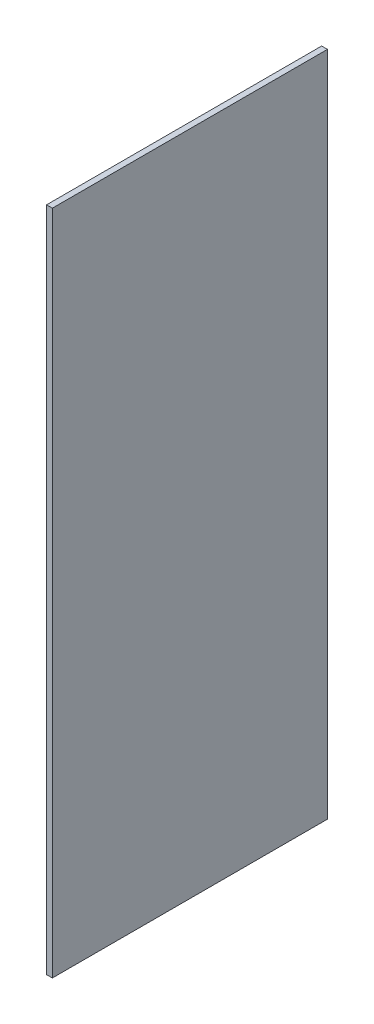
ISO-10303-21;
HEADER;
FILE_DESCRIPTION(('STEP AP214'),'2;1');
FILE_NAME('part.step','',(''),(''),'','','');
FILE_SCHEMA(('AUTOMOTIVE_DESIGN { 1 0 10303 214 1 1 1 1 }'));
ENDSEC;
DATA;
#1=APPLICATION_CONTEXT('core data for automotive mechanical design processes');
#2=APPLICATION_PROTOCOL_DEFINITION('international standard','automotive_design',2000,#1);
#3=PRODUCT_CONTEXT('',#1,'mechanical');
#4=PRODUCT('Part','Part','',(#3));
#5=PRODUCT_RELATED_PRODUCT_CATEGORY('part','',(#4));
#6=PRODUCT_DEFINITION_FORMATION('','',#4);
#7=PRODUCT_DEFINITION_CONTEXT('part definition',#1,'design');
#8=PRODUCT_DEFINITION('design','',#6,#7);
#9=PRODUCT_DEFINITION_SHAPE('','',#8);
#10=(LENGTH_UNIT() NAMED_UNIT(*) SI_UNIT(.MILLI.,.METRE.));
#11=(NAMED_UNIT(*) PLANE_ANGLE_UNIT() SI_UNIT($,.RADIAN.));
#12=(NAMED_UNIT(*) SI_UNIT($,.STERADIAN.) SOLID_ANGLE_UNIT());
#13=UNCERTAINTY_MEASURE_WITH_UNIT(LENGTH_MEASURE(1.E-05),#10,'distance_accuracy_value','');
#14=(GEOMETRIC_REPRESENTATION_CONTEXT(3) GLOBAL_UNCERTAINTY_ASSIGNED_CONTEXT((#13)) GLOBAL_UNIT_ASSIGNED_CONTEXT((#10,
#11,#12)) REPRESENTATION_CONTEXT('',''));
#15=CARTESIAN_POINT('',(0.,0.,0.));
#16=DIRECTION('',(0.,0.,1.));
#17=DIRECTION('',(1.,0.,0.));
#18=AXIS2_PLACEMENT_3D('',#15,#16,#17);
#19=CARTESIAN_POINT('',(281.,-45.,128.442125645559));
#20=DIRECTION('',(0.,0.,-1.));
#21=DIRECTION('',(-1.,0.,0.));
#22=AXIS2_PLACEMENT_3D('',#19,#20,#21);
#23=PLANE('',#22);
#24=DIRECTION('',(0.,-1.,0.));
#25=VECTOR('',#24,1.);
#26=CARTESIAN_POINT('',(280.,-45.,128.442125645559));
#27=LINE('',#26,#25);
#28=CARTESIAN_POINT('',(280.,69.8959813156576,128.442125645559));
#29=VERTEX_POINT('',#28);
#30=CARTESIAN_POINT('',(280.,-45.,128.442125645559));
#31=VERTEX_POINT('',#30);
#32=EDGE_CURVE('E101',#29,#31,#27,.T.);
#33=ORIENTED_EDGE('',*,*,#32,.T.);
#34=DIRECTION('',(-1.,0.,0.));
#35=VECTOR('',#34,1.);
#36=CARTESIAN_POINT('',(281.,-45.,128.442125645559));
#37=LINE('',#36,#35);
#38=CARTESIAN_POINT('',(281.,-45.,128.442125645559));
#39=VERTEX_POINT('',#38);
#40=EDGE_CURVE('E11',#39,#31,#37,.T.);
#41=ORIENTED_EDGE('',*,*,#40,.F.);
#42=DIRECTION('',(0.,-1.,0.));
#43=VECTOR('',#42,1.);
#44=CARTESIAN_POINT('',(281.,-45.,128.442125645559));
#45=LINE('',#44,#43);
#46=CARTESIAN_POINT('',(281.,69.8959813156576,128.442125645559));
#47=VERTEX_POINT('',#46);
#48=EDGE_CURVE('E89',#47,#39,#45,.T.);
#49=ORIENTED_EDGE('',*,*,#48,.F.);
#50=DIRECTION('',(-1.,0.,0.));
#51=VECTOR('',#50,1.);
#52=CARTESIAN_POINT('',(281.,69.8959813156576,128.442125645559));
#53=LINE('',#52,#51);
#54=EDGE_CURVE('E97',#47,#29,#53,.T.);
#55=ORIENTED_EDGE('',*,*,#54,.T.);
#56=EDGE_LOOP('',(#33,#41,#49,#55));
#57=FACE_BOUND('',#56,.T.);
#58=ADVANCED_FACE('F38',(#57),#23,.F.);
#59=CARTESIAN_POINT('',(281.,-45.,128.442125645559));
#60=DIRECTION('',(0.,1.,0.));
#61=DIRECTION('',(0.,0.,1.));
#62=AXIS2_PLACEMENT_3D('',#59,#60,#61);
#63=PLANE('',#62);
#64=DIRECTION('',(0.,0.,-1.));
#65=VECTOR('',#64,1.);
#66=CARTESIAN_POINT('',(280.,-45.,128.442125645559));
#67=LINE('',#66,#65);
#68=CARTESIAN_POINT('',(280.,-45.,81.035636223129));
#69=VERTEX_POINT('',#68);
#70=EDGE_CURVE('E93',#31,#69,#67,.T.);
#71=ORIENTED_EDGE('',*,*,#70,.T.);
#72=DIRECTION('',(-1.,0.,0.));
#73=VECTOR('',#72,1.);
#74=CARTESIAN_POINT('',(281.,-45.,81.035636223129));
#75=LINE('',#74,#73);
#76=CARTESIAN_POINT('',(281.,-45.,81.035636223129));
#77=VERTEX_POINT('',#76);
#78=EDGE_CURVE('E46',#77,#69,#75,.T.);
#79=ORIENTED_EDGE('',*,*,#78,.F.);
#80=DIRECTION('',(0.,0.,-1.));
#81=VECTOR('',#80,1.);
#82=CARTESIAN_POINT('',(281.,-45.,128.442125645559));
#83=LINE('',#82,#81);
#84=EDGE_CURVE('E84',#39,#77,#83,.T.);
#85=ORIENTED_EDGE('',*,*,#84,.F.);
#86=ORIENTED_EDGE('',*,*,#40,.T.);
#87=EDGE_LOOP('',(#71,#79,#85,#86));
#88=FACE_BOUND('',#87,.T.);
#89=ADVANCED_FACE('F92',(#88),#63,.F.);
#90=CARTESIAN_POINT('',(281.,-45.,81.035636223129));
#91=DIRECTION('',(0.,0.,1.));
#92=DIRECTION('',(1.,0.,0.));
#93=AXIS2_PLACEMENT_3D('',#90,#91,#92);
#94=PLANE('',#93);
#95=DIRECTION('',(0.,1.,0.));
#96=VECTOR('',#95,1.);
#97=CARTESIAN_POINT('',(280.,-45.,81.035636223129));
#98=LINE('',#97,#96);
#99=CARTESIAN_POINT('',(280.,69.8959813156576,81.035636223129));
#100=VERTEX_POINT('',#99);
#101=EDGE_CURVE('E71',#69,#100,#98,.T.);
#102=ORIENTED_EDGE('',*,*,#101,.T.);
#103=DIRECTION('',(-1.,0.,0.));
#104=VECTOR('',#103,1.);
#105=CARTESIAN_POINT('',(281.,69.8959813156576,81.035636223129));
#106=LINE('',#105,#104);
#107=CARTESIAN_POINT('',(281.,69.8959813156576,81.035636223129));
#108=VERTEX_POINT('',#107);
#109=EDGE_CURVE('E94',#108,#100,#106,.T.);
#110=ORIENTED_EDGE('',*,*,#109,.F.);
#111=DIRECTION('',(0.,1.,0.));
#112=VECTOR('',#111,1.);
#113=CARTESIAN_POINT('',(281.,-45.,81.035636223129));
#114=LINE('',#113,#112);
#115=EDGE_CURVE('E87',#77,#108,#114,.T.);
#116=ORIENTED_EDGE('',*,*,#115,.F.);
#117=ORIENTED_EDGE('',*,*,#78,.T.);
#118=EDGE_LOOP('',(#102,#110,#116,#117));
#119=FACE_BOUND('',#118,.T.);
#120=ADVANCED_FACE('F95',(#119),#94,.F.);
#121=CARTESIAN_POINT('',(281.,69.8959813156576,128.442125645559));
#122=DIRECTION('',(0.,-1.,0.));
#123=DIRECTION('',(0.,0.,-1.));
#124=AXIS2_PLACEMENT_3D('',#121,#122,#123);
#125=PLANE('',#124);
#126=DIRECTION('',(0.,0.,1.));
#127=VECTOR('',#126,1.);
#128=CARTESIAN_POINT('',(280.,69.8959813156576,128.442125645559));
#129=LINE('',#128,#127);
#130=EDGE_CURVE('E77',#100,#29,#129,.T.);
#131=ORIENTED_EDGE('',*,*,#130,.T.);
#132=ORIENTED_EDGE('',*,*,#54,.F.);
#133=DIRECTION('',(0.,0.,1.));
#134=VECTOR('',#133,1.);
#135=CARTESIAN_POINT('',(281.,69.8959813156576,128.442125645559));
#136=LINE('',#135,#134);
#137=EDGE_CURVE('E54',#108,#47,#136,.T.);
#138=ORIENTED_EDGE('',*,*,#137,.F.);
#139=ORIENTED_EDGE('',*,*,#109,.T.);
#140=EDGE_LOOP('',(#131,#132,#138,#139));
#141=FACE_BOUND('',#140,.T.);
#142=ADVANCED_FACE('F108',(#141),#125,.F.);
#143=CARTESIAN_POINT('',(281.,0.,0.));
#144=DIRECTION('',(-1.,0.,0.));
#145=DIRECTION('',(0.,0.,1.));
#146=AXIS2_PLACEMENT_3D('',#143,#144,#145);
#147=PLANE('',#146);
#148=ORIENTED_EDGE('',*,*,#48,.T.);
#149=ORIENTED_EDGE('',*,*,#84,.T.);
#150=ORIENTED_EDGE('',*,*,#115,.T.);
#151=ORIENTED_EDGE('',*,*,#137,.T.);
#152=EDGE_LOOP('',(#148,#149,#150,#151));
#153=FACE_BOUND('',#152,.T.);
#154=ADVANCED_FACE('F85',(#153),#147,.F.);
#155=CARTESIAN_POINT('',(280.,0.,0.));
#156=DIRECTION('',(-1.,0.,0.));
#157=DIRECTION('',(0.,0.,1.));
#158=AXIS2_PLACEMENT_3D('',#155,#156,#157);
#159=PLANE('',#158);
#160=ORIENTED_EDGE('',*,*,#32,.F.);
#161=ORIENTED_EDGE('',*,*,#130,.F.);
#162=ORIENTED_EDGE('',*,*,#101,.F.);
#163=ORIENTED_EDGE('',*,*,#70,.F.);
#164=EDGE_LOOP('',(#160,#161,#162,#163));
#165=FACE_BOUND('',#164,.T.);
#166=ADVANCED_FACE('F111',(#165),#159,.T.);
#167=CLOSED_SHELL('',(#58,#89,#120,#142,#154,#166));
#168=MANIFOLD_SOLID_BREP('B2',#167);
#169=ADVANCED_BREP_SHAPE_REPRESENTATION('',(#18,#168),#14);
#170=SHAPE_DEFINITION_REPRESENTATION(#9,#169);
ENDSEC;
END-ISO-10303-21;
